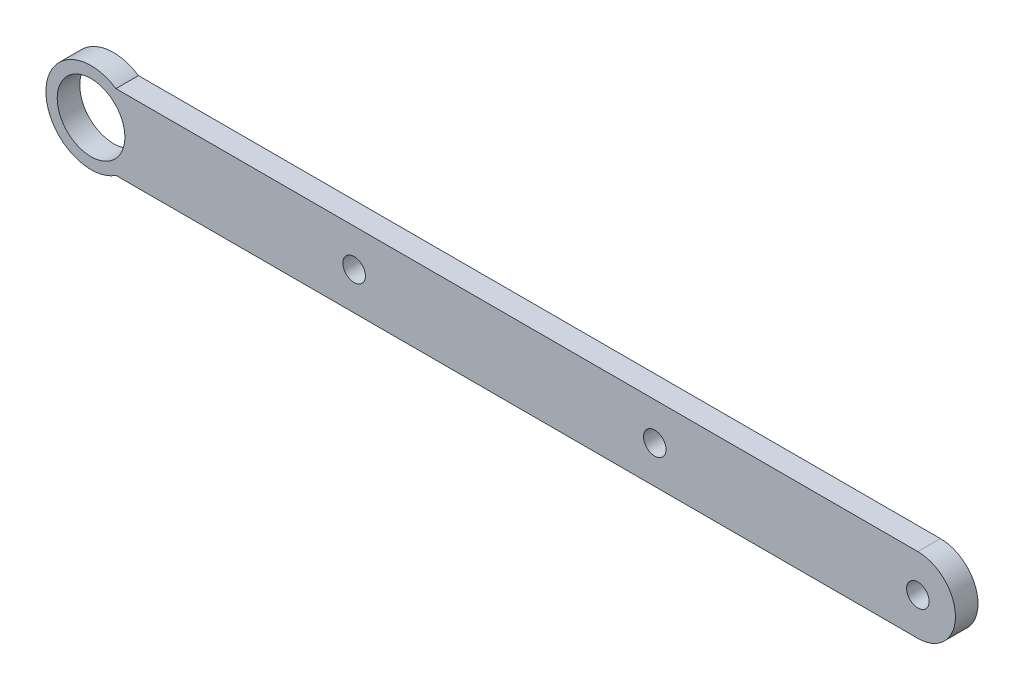
ISO-10303-21;
HEADER;
FILE_DESCRIPTION(('STEP AP214'),'2;1');
FILE_NAME('part.step','',(''),(''),'','','');
FILE_SCHEMA(('AUTOMOTIVE_DESIGN { 1 0 10303 214 1 1 1 1 }'));
ENDSEC;
DATA;
#1=APPLICATION_CONTEXT('core data for automotive mechanical design processes');
#2=APPLICATION_PROTOCOL_DEFINITION('international standard','automotive_design',2000,#1);
#3=PRODUCT_CONTEXT('',#1,'mechanical');
#4=PRODUCT('Part','Part','',(#3));
#5=PRODUCT_RELATED_PRODUCT_CATEGORY('part','',(#4));
#6=PRODUCT_DEFINITION_FORMATION('','',#4);
#7=PRODUCT_DEFINITION_CONTEXT('part definition',#1,'design');
#8=PRODUCT_DEFINITION('design','',#6,#7);
#9=PRODUCT_DEFINITION_SHAPE('','',#8);
#10=(LENGTH_UNIT() NAMED_UNIT(*) SI_UNIT(.MILLI.,.METRE.));
#11=(NAMED_UNIT(*) PLANE_ANGLE_UNIT() SI_UNIT($,.RADIAN.));
#12=(NAMED_UNIT(*) SI_UNIT($,.STERADIAN.) SOLID_ANGLE_UNIT());
#13=UNCERTAINTY_MEASURE_WITH_UNIT(LENGTH_MEASURE(1.E-05),#10,'distance_accuracy_value','');
#14=(GEOMETRIC_REPRESENTATION_CONTEXT(3) GLOBAL_UNCERTAINTY_ASSIGNED_CONTEXT((#13)) GLOBAL_UNIT_ASSIGNED_CONTEXT((#10,
#11,#12)) REPRESENTATION_CONTEXT('',''));
#15=CARTESIAN_POINT('',(0.,0.,0.));
#16=DIRECTION('',(0.,0.,1.));
#17=DIRECTION('',(1.,0.,0.));
#18=AXIS2_PLACEMENT_3D('',#15,#16,#17);
#19=CARTESIAN_POINT('',(55.,0.,3.));
#20=DIRECTION('',(0.,0.,-1.));
#21=DIRECTION('',(1.,0.,0.));
#22=AXIS2_PLACEMENT_3D('',#19,#20,#21);
#23=CYLINDRICAL_SURFACE('',#22,1.5);
#24=DIRECTION('',(0.,0.,-1.));
#25=VECTOR('',#24,1.);
#26=CARTESIAN_POINT('',(56.5,0.,3.));
#27=LINE('',#26,#25);
#28=CARTESIAN_POINT('',(56.5,0.,3.));
#29=VERTEX_POINT('',#28);
#30=CARTESIAN_POINT('',(56.5,0.,0.));
#31=VERTEX_POINT('',#30);
#32=EDGE_CURVE('E51',#29,#31,#27,.T.);
#33=ORIENTED_EDGE('',*,*,#32,.F.);
#34=CARTESIAN_POINT('',(55.,0.,3.));
#35=DIRECTION('',(0.,0.,1.));
#36=DIRECTION('',(1.,0.,0.));
#37=AXIS2_PLACEMENT_3D('',#34,#35,#36);
#38=CIRCLE('',#37,1.5);
#39=EDGE_CURVE('E129',#29,#29,#38,.T.);
#40=ORIENTED_EDGE('',*,*,#39,.T.);
#41=ORIENTED_EDGE('',*,*,#32,.T.);
#42=CARTESIAN_POINT('',(55.,0.,0.));
#43=DIRECTION('',(0.,0.,-1.));
#44=DIRECTION('',(1.,0.,0.));
#45=AXIS2_PLACEMENT_3D('',#42,#43,#44);
#46=CIRCLE('',#45,1.5);
#47=EDGE_CURVE('E146',#31,#31,#46,.T.);
#48=ORIENTED_EDGE('',*,*,#47,.T.);
#49=EDGE_LOOP('',(#33,#40,#41,#48));
#50=FACE_BOUND('',#49,.T.);
#51=ADVANCED_FACE('F42',(#50),#23,.F.);
#52=CARTESIAN_POINT('',(20.,0.,0.));
#53=DIRECTION('',(0.,0.,-1.));
#54=DIRECTION('',(1.,0.,0.));
#55=AXIS2_PLACEMENT_3D('',#52,#53,#54);
#56=CYLINDRICAL_SURFACE('',#55,1.5);
#57=DIRECTION('',(0.,0.,1.));
#58=VECTOR('',#57,1.);
#59=CARTESIAN_POINT('',(21.5,0.,0.));
#60=LINE('',#59,#58);
#61=CARTESIAN_POINT('',(21.5,0.,0.));
#62=VERTEX_POINT('',#61);
#63=CARTESIAN_POINT('',(21.5,0.,3.));
#64=VERTEX_POINT('',#63);
#65=EDGE_CURVE('E134',#62,#64,#60,.T.);
#66=ORIENTED_EDGE('',*,*,#65,.T.);
#67=CARTESIAN_POINT('',(20.,0.,3.));
#68=DIRECTION('',(0.,0.,1.));
#69=DIRECTION('',(1.,0.,0.));
#70=AXIS2_PLACEMENT_3D('',#67,#68,#69);
#71=CIRCLE('',#70,1.5);
#72=EDGE_CURVE('E133',#64,#64,#71,.T.);
#73=ORIENTED_EDGE('',*,*,#72,.T.);
#74=ORIENTED_EDGE('',*,*,#65,.F.);
#75=CARTESIAN_POINT('',(20.,0.,0.));
#76=DIRECTION('',(0.,0.,1.));
#77=DIRECTION('',(1.,0.,0.));
#78=AXIS2_PLACEMENT_3D('',#75,#76,#77);
#79=CIRCLE('',#78,1.5);
#80=EDGE_CURVE('E139',#62,#62,#79,.T.);
#81=ORIENTED_EDGE('',*,*,#80,.F.);
#82=EDGE_LOOP('',(#66,#73,#74,#81));
#83=FACE_BOUND('',#82,.T.);
#84=ADVANCED_FACE('F175',(#83),#56,.F.);
#85=CARTESIAN_POINT('',(-20.,0.,0.));
#86=DIRECTION('',(0.,0.,-1.));
#87=DIRECTION('',(1.,0.,0.));
#88=AXIS2_PLACEMENT_3D('',#85,#86,#87);
#89=CYLINDRICAL_SURFACE('',#88,1.5);
#90=DIRECTION('',(0.,0.,1.));
#91=VECTOR('',#90,1.);
#92=CARTESIAN_POINT('',(-18.5,0.,0.));
#93=LINE('',#92,#91);
#94=CARTESIAN_POINT('',(-18.5,0.,0.));
#95=VERTEX_POINT('',#94);
#96=CARTESIAN_POINT('',(-18.5,0.,3.));
#97=VERTEX_POINT('',#96);
#98=EDGE_CURVE('E132',#95,#97,#93,.T.);
#99=ORIENTED_EDGE('',*,*,#98,.T.);
#100=CARTESIAN_POINT('',(-20.,0.,3.));
#101=DIRECTION('',(0.,0.,1.));
#102=DIRECTION('',(1.,0.,0.));
#103=AXIS2_PLACEMENT_3D('',#100,#101,#102);
#104=CIRCLE('',#103,1.5);
#105=EDGE_CURVE('E154',#97,#97,#104,.T.);
#106=ORIENTED_EDGE('',*,*,#105,.T.);
#107=ORIENTED_EDGE('',*,*,#98,.F.);
#108=CARTESIAN_POINT('',(-20.,0.,0.));
#109=DIRECTION('',(0.,0.,1.));
#110=DIRECTION('',(1.,0.,0.));
#111=AXIS2_PLACEMENT_3D('',#108,#109,#110);
#112=CIRCLE('',#111,1.5);
#113=EDGE_CURVE('E136',#95,#95,#112,.T.);
#114=ORIENTED_EDGE('',*,*,#113,.F.);
#115=EDGE_LOOP('',(#99,#106,#107,#114));
#116=FACE_BOUND('',#115,.T.);
#117=ADVANCED_FACE('F161',(#116),#89,.F.);
#118=CARTESIAN_POINT('',(0.,0.,3.));
#119=DIRECTION('',(0.,0.,1.));
#120=DIRECTION('',(1.,0.,0.));
#121=AXIS2_PLACEMENT_3D('',#118,#119,#120);
#122=PLANE('',#121);
#123=CARTESIAN_POINT('',(-55.,0.,3.));
#124=DIRECTION('',(0.,0.,-1.));
#125=DIRECTION('',(-1.,0.,0.));
#126=AXIS2_PLACEMENT_3D('',#123,#124,#125);
#127=CIRCLE('',#126,4.5);
#128=CARTESIAN_POINT('',(-59.5,0.,3.));
#129=VERTEX_POINT('',#128);
#130=EDGE_CURVE('E121',#129,#129,#127,.T.);
#131=ORIENTED_EDGE('',*,*,#130,.T.);
#132=EDGE_LOOP('',(#131));
#133=FACE_BOUND('',#132,.T.);
#134=DIRECTION('',(1.,0.,0.));
#135=VECTOR('',#134,1.);
#136=CARTESIAN_POINT('',(-55.,5.,3.));
#137=LINE('',#136,#135);
#138=CARTESIAN_POINT('',(-51.6833752096446,5.,3.));
#139=VERTEX_POINT('',#138);
#140=CARTESIAN_POINT('',(55.,5.,3.));
#141=VERTEX_POINT('',#140);
#142=EDGE_CURVE('E143',#139,#141,#137,.T.);
#143=ORIENTED_EDGE('',*,*,#142,.F.);
#144=CARTESIAN_POINT('',(-55.,0.,3.));
#145=DIRECTION('',(0.,0.,-1.));
#146=DIRECTION('',(-1.,0.,0.));
#147=AXIS2_PLACEMENT_3D('',#144,#145,#146);
#148=CIRCLE('',#147,5.99999999999999);
#149=CARTESIAN_POINT('',(-51.6833752096446,-5.,3.));
#150=VERTEX_POINT('',#149);
#151=EDGE_CURVE('E117',#150,#139,#148,.T.);
#152=ORIENTED_EDGE('',*,*,#151,.F.);
#153=DIRECTION('',(1.,0.,0.));
#154=VECTOR('',#153,1.);
#155=CARTESIAN_POINT('',(-55.,-5.,3.));
#156=LINE('',#155,#154);
#157=CARTESIAN_POINT('',(55.,-5.,3.));
#158=VERTEX_POINT('',#157);
#159=EDGE_CURVE('E109',#150,#158,#156,.T.);
#160=ORIENTED_EDGE('',*,*,#159,.T.);
#161=CARTESIAN_POINT('',(55.,0.,3.));
#162=DIRECTION('',(0.,0.,1.));
#163=DIRECTION('',(1.,0.,0.));
#164=AXIS2_PLACEMENT_3D('',#161,#162,#163);
#165=CIRCLE('',#164,5.);
#166=EDGE_CURVE('E128',#158,#141,#165,.T.);
#167=ORIENTED_EDGE('',*,*,#166,.T.);
#168=EDGE_LOOP('',(#143,#152,#160,#167));
#169=FACE_BOUND('',#168,.T.);
#170=ORIENTED_EDGE('',*,*,#39,.F.);
#171=EDGE_LOOP('',(#170));
#172=FACE_BOUND('',#171,.T.);
#173=ORIENTED_EDGE('',*,*,#72,.F.);
#174=EDGE_LOOP('',(#173));
#175=FACE_BOUND('',#174,.T.);
#176=ORIENTED_EDGE('',*,*,#105,.F.);
#177=EDGE_LOOP('',(#176));
#178=FACE_BOUND('',#177,.T.);
#179=ADVANCED_FACE('F164',(#133,#169,#172,#175,#178),#122,.T.);
#180=CARTESIAN_POINT('',(0.,0.,0.));
#181=DIRECTION('',(0.,0.,1.));
#182=DIRECTION('',(1.,0.,0.));
#183=AXIS2_PLACEMENT_3D('',#180,#181,#182);
#184=PLANE('',#183);
#185=CARTESIAN_POINT('',(-55.,0.,0.));
#186=DIRECTION('',(0.,0.,1.));
#187=DIRECTION('',(1.,0.,0.));
#188=AXIS2_PLACEMENT_3D('',#185,#186,#187);
#189=CIRCLE('',#188,4.5);
#190=CARTESIAN_POINT('',(-50.5,0.,0.));
#191=VERTEX_POINT('',#190);
#192=EDGE_CURVE('E46',#191,#191,#189,.T.);
#193=ORIENTED_EDGE('',*,*,#192,.T.);
#194=EDGE_LOOP('',(#193));
#195=FACE_BOUND('',#194,.T.);
#196=ORIENTED_EDGE('',*,*,#47,.F.);
#197=EDGE_LOOP('',(#196));
#198=FACE_BOUND('',#197,.T.);
#199=ORIENTED_EDGE('',*,*,#80,.T.);
#200=EDGE_LOOP('',(#199));
#201=FACE_BOUND('',#200,.T.);
#202=ORIENTED_EDGE('',*,*,#113,.T.);
#203=EDGE_LOOP('',(#202));
#204=FACE_BOUND('',#203,.T.);
#205=DIRECTION('',(1.,0.,0.));
#206=VECTOR('',#205,1.);
#207=CARTESIAN_POINT('',(-55.,-5.,0.));
#208=LINE('',#207,#206);
#209=CARTESIAN_POINT('',(-51.6833752096446,-5.,0.));
#210=VERTEX_POINT('',#209);
#211=CARTESIAN_POINT('',(55.,-5.,0.));
#212=VERTEX_POINT('',#211);
#213=EDGE_CURVE('E100',#210,#212,#208,.T.);
#214=ORIENTED_EDGE('',*,*,#213,.F.);
#215=CARTESIAN_POINT('',(-55.,0.,0.));
#216=DIRECTION('',(0.,0.,-1.));
#217=DIRECTION('',(-1.,0.,0.));
#218=AXIS2_PLACEMENT_3D('',#215,#216,#217);
#219=CIRCLE('',#218,5.99999999999999);
#220=CARTESIAN_POINT('',(-51.6833752096446,5.,0.));
#221=VERTEX_POINT('',#220);
#222=EDGE_CURVE('E103',#210,#221,#219,.T.);
#223=ORIENTED_EDGE('',*,*,#222,.T.);
#224=DIRECTION('',(1.,0.,0.));
#225=VECTOR('',#224,1.);
#226=CARTESIAN_POINT('',(-55.,5.,0.));
#227=LINE('',#226,#225);
#228=CARTESIAN_POINT('',(55.,5.,0.));
#229=VERTEX_POINT('',#228);
#230=EDGE_CURVE('E58',#221,#229,#227,.T.);
#231=ORIENTED_EDGE('',*,*,#230,.T.);
#232=CARTESIAN_POINT('',(55.,0.,0.));
#233=DIRECTION('',(0.,0.,1.));
#234=DIRECTION('',(1.,0.,0.));
#235=AXIS2_PLACEMENT_3D('',#232,#233,#234);
#236=CIRCLE('',#235,5.);
#237=EDGE_CURVE('E105',#212,#229,#236,.T.);
#238=ORIENTED_EDGE('',*,*,#237,.F.);
#239=EDGE_LOOP('',(#214,#223,#231,#238));
#240=FACE_BOUND('',#239,.T.);
#241=ADVANCED_FACE('F101',(#195,#198,#201,#204,#240),#184,.F.);
#242=CARTESIAN_POINT('',(-55.,5.,0.));
#243=DIRECTION('',(0.,1.,0.));
#244=DIRECTION('',(1.,0.,0.));
#245=AXIS2_PLACEMENT_3D('',#242,#243,#244);
#246=PLANE('',#245);
#247=DIRECTION('',(0.,0.,-1.));
#248=VECTOR('',#247,1.);
#249=CARTESIAN_POINT('',(-51.6833752096446,5.,3.));
#250=LINE('',#249,#248);
#251=EDGE_CURVE('E62',#139,#221,#250,.T.);
#252=ORIENTED_EDGE('',*,*,#251,.F.);
#253=ORIENTED_EDGE('',*,*,#142,.T.);
#254=DIRECTION('',(0.,0.,1.));
#255=VECTOR('',#254,1.);
#256=CARTESIAN_POINT('',(55.,5.,0.));
#257=LINE('',#256,#255);
#258=EDGE_CURVE('E125',#229,#141,#257,.T.);
#259=ORIENTED_EDGE('',*,*,#258,.F.);
#260=ORIENTED_EDGE('',*,*,#230,.F.);
#261=EDGE_LOOP('',(#252,#253,#259,#260));
#262=FACE_BOUND('',#261,.T.);
#263=ADVANCED_FACE('F172',(#262),#246,.T.);
#264=CARTESIAN_POINT('',(-55.,-5.,0.));
#265=DIRECTION('',(0.,1.,0.));
#266=DIRECTION('',(1.,0.,0.));
#267=AXIS2_PLACEMENT_3D('',#264,#265,#266);
#268=PLANE('',#267);
#269=ORIENTED_EDGE('',*,*,#159,.F.);
#270=DIRECTION('',(0.,0.,-1.));
#271=VECTOR('',#270,1.);
#272=CARTESIAN_POINT('',(-51.6833752096446,-5.,3.));
#273=LINE('',#272,#271);
#274=EDGE_CURVE('E11',#150,#210,#273,.T.);
#275=ORIENTED_EDGE('',*,*,#274,.T.);
#276=ORIENTED_EDGE('',*,*,#213,.T.);
#277=DIRECTION('',(0.,0.,1.));
#278=VECTOR('',#277,1.);
#279=CARTESIAN_POINT('',(55.,-5.,0.));
#280=LINE('',#279,#278);
#281=EDGE_CURVE('E110',#212,#158,#280,.T.);
#282=ORIENTED_EDGE('',*,*,#281,.T.);
#283=EDGE_LOOP('',(#269,#275,#276,#282));
#284=FACE_BOUND('',#283,.T.);
#285=ADVANCED_FACE('F44',(#284),#268,.F.);
#286=CARTESIAN_POINT('',(55.,0.,0.));
#287=DIRECTION('',(0.,0.,-1.));
#288=DIRECTION('',(1.,0.,0.));
#289=AXIS2_PLACEMENT_3D('',#286,#287,#288);
#290=CYLINDRICAL_SURFACE('',#289,5.);
#291=ORIENTED_EDGE('',*,*,#237,.T.);
#292=ORIENTED_EDGE('',*,*,#258,.T.);
#293=ORIENTED_EDGE('',*,*,#166,.F.);
#294=ORIENTED_EDGE('',*,*,#281,.F.);
#295=EDGE_LOOP('',(#291,#292,#293,#294));
#296=FACE_BOUND('',#295,.T.);
#297=ADVANCED_FACE('F189',(#296),#290,.T.);
#298=CARTESIAN_POINT('',(-55.,0.,3.));
#299=DIRECTION('',(0.,0.,-1.));
#300=DIRECTION('',(-1.,0.,0.));
#301=AXIS2_PLACEMENT_3D('',#298,#299,#300);
#302=CYLINDRICAL_SURFACE('',#301,5.99999999999999);
#303=ORIENTED_EDGE('',*,*,#151,.T.);
#304=ORIENTED_EDGE('',*,*,#251,.T.);
#305=ORIENTED_EDGE('',*,*,#222,.F.);
#306=ORIENTED_EDGE('',*,*,#274,.F.);
#307=EDGE_LOOP('',(#303,#304,#305,#306));
#308=FACE_BOUND('',#307,.T.);
#309=ADVANCED_FACE('F116',(#308),#302,.T.);
#310=CARTESIAN_POINT('',(-55.,0.,3.));
#311=DIRECTION('',(0.,0.,-1.));
#312=DIRECTION('',(-1.,0.,0.));
#313=AXIS2_PLACEMENT_3D('',#310,#311,#312);
#314=CYLINDRICAL_SURFACE('',#313,4.5);
#315=ORIENTED_EDGE('',*,*,#130,.F.);
#316=EDGE_LOOP('',(#315));
#317=FACE_BOUND('',#316,.T.);
#318=ORIENTED_EDGE('',*,*,#192,.F.);
#319=EDGE_LOOP('',(#318));
#320=FACE_BOUND('',#319,.T.);
#321=ADVANCED_FACE('F195',(#317,#320),#314,.F.);
#322=CLOSED_SHELL('',(#51,#84,#117,#179,#241,#263,#285,#297,#309,#321));
#323=MANIFOLD_SOLID_BREP('B2',#322);
#324=ADVANCED_BREP_SHAPE_REPRESENTATION('',(#18,#323),#14);
#325=SHAPE_DEFINITION_REPRESENTATION(#9,#324);
ENDSEC;
END-ISO-10303-21;
